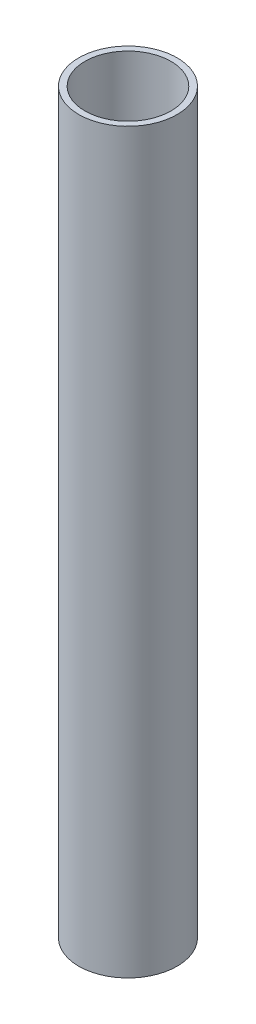
ISO-10303-21;
HEADER;
FILE_DESCRIPTION(('STEP AP214'),'2;1');
FILE_NAME('part.step','',(''),(''),'','','');
FILE_SCHEMA(('AUTOMOTIVE_DESIGN { 1 0 10303 214 1 1 1 1 }'));
ENDSEC;
DATA;
#1=APPLICATION_CONTEXT('core data for automotive mechanical design processes');
#2=APPLICATION_PROTOCOL_DEFINITION('international standard','automotive_design',2000,#1);
#3=PRODUCT_CONTEXT('',#1,'mechanical');
#4=PRODUCT('Part','Part','',(#3));
#5=PRODUCT_RELATED_PRODUCT_CATEGORY('part','',(#4));
#6=PRODUCT_DEFINITION_FORMATION('','',#4);
#7=PRODUCT_DEFINITION_CONTEXT('part definition',#1,'design');
#8=PRODUCT_DEFINITION('design','',#6,#7);
#9=PRODUCT_DEFINITION_SHAPE('','',#8);
#10=(LENGTH_UNIT() NAMED_UNIT(*) SI_UNIT(.MILLI.,.METRE.));
#11=(NAMED_UNIT(*) PLANE_ANGLE_UNIT() SI_UNIT($,.RADIAN.));
#12=(NAMED_UNIT(*) SI_UNIT($,.STERADIAN.) SOLID_ANGLE_UNIT());
#13=UNCERTAINTY_MEASURE_WITH_UNIT(LENGTH_MEASURE(1.E-05),#10,'distance_accuracy_value','');
#14=(GEOMETRIC_REPRESENTATION_CONTEXT(3) GLOBAL_UNCERTAINTY_ASSIGNED_CONTEXT((#13)) GLOBAL_UNIT_ASSIGNED_CONTEXT((#10,
#11,#12)) REPRESENTATION_CONTEXT('',''));
#15=CARTESIAN_POINT('',(0.,0.,0.));
#16=DIRECTION('',(0.,0.,1.));
#17=DIRECTION('',(1.,0.,0.));
#18=AXIS2_PLACEMENT_3D('',#15,#16,#17);
#19=CARTESIAN_POINT('',(0.,762.,0.));
#20=DIRECTION('',(0.,1.,0.));
#21=DIRECTION('',(0.,0.,1.));
#22=AXIS2_PLACEMENT_3D('',#19,#20,#21);
#23=PLANE('',#22);
#24=CARTESIAN_POINT('',(0.,762.,0.));
#25=DIRECTION('',(0.,1.,0.));
#26=DIRECTION('',(0.,0.,1.));
#27=AXIS2_PLACEMENT_3D('',#24,#25,#26);
#28=CIRCLE('',#27,50.8);
#29=CARTESIAN_POINT('',(0.,762.,50.8));
#30=VERTEX_POINT('',#29);
#31=EDGE_CURVE('E10',#30,#30,#28,.T.);
#32=ORIENTED_EDGE('',*,*,#31,.T.);
#33=EDGE_LOOP('',(#32));
#34=FACE_BOUND('',#33,.T.);
#35=CARTESIAN_POINT('',(0.,762.,0.));
#36=DIRECTION('',(0.,1.,0.));
#37=DIRECTION('',(0.,0.,1.));
#38=AXIS2_PLACEMENT_3D('',#35,#36,#37);
#39=CIRCLE('',#38,44.45);
#40=CARTESIAN_POINT('',(0.,762.,44.45));
#41=VERTEX_POINT('',#40);
#42=EDGE_CURVE('E42',#41,#41,#39,.T.);
#43=ORIENTED_EDGE('',*,*,#42,.F.);
#44=EDGE_LOOP('',(#43));
#45=FACE_BOUND('',#44,.T.);
#46=ADVANCED_FACE('F31',(#34,#45),#23,.T.);
#47=CARTESIAN_POINT('',(0.,0.,0.));
#48=DIRECTION('',(0.,1.,0.));
#49=DIRECTION('',(0.,0.,1.));
#50=AXIS2_PLACEMENT_3D('',#47,#48,#49);
#51=PLANE('',#50);
#52=CARTESIAN_POINT('',(0.,0.,0.));
#53=DIRECTION('',(0.,1.,0.));
#54=DIRECTION('',(0.,0.,1.));
#55=AXIS2_PLACEMENT_3D('',#52,#53,#54);
#56=CIRCLE('',#55,50.8);
#57=CARTESIAN_POINT('',(0.,0.,50.8));
#58=VERTEX_POINT('',#57);
#59=EDGE_CURVE('E35',#58,#58,#56,.T.);
#60=ORIENTED_EDGE('',*,*,#59,.F.);
#61=EDGE_LOOP('',(#60));
#62=FACE_BOUND('',#61,.T.);
#63=CARTESIAN_POINT('',(0.,0.,0.));
#64=DIRECTION('',(0.,1.,0.));
#65=DIRECTION('',(0.,0.,1.));
#66=AXIS2_PLACEMENT_3D('',#63,#64,#65);
#67=CIRCLE('',#66,44.45);
#68=CARTESIAN_POINT('',(0.,0.,44.45));
#69=VERTEX_POINT('',#68);
#70=EDGE_CURVE('E44',#69,#69,#67,.T.);
#71=ORIENTED_EDGE('',*,*,#70,.T.);
#72=EDGE_LOOP('',(#71));
#73=FACE_BOUND('',#72,.T.);
#74=ADVANCED_FACE('F54',(#62,#73),#51,.F.);
#75=CARTESIAN_POINT('',(0.,762.,0.));
#76=DIRECTION('',(0.,-1.,0.));
#77=DIRECTION('',(0.,0.,-1.));
#78=AXIS2_PLACEMENT_3D('',#75,#76,#77);
#79=CYLINDRICAL_SURFACE('',#78,50.8);
#80=ORIENTED_EDGE('',*,*,#31,.F.);
#81=EDGE_LOOP('',(#80));
#82=FACE_BOUND('',#81,.T.);
#83=ORIENTED_EDGE('',*,*,#59,.T.);
#84=EDGE_LOOP('',(#83));
#85=FACE_BOUND('',#84,.T.);
#86=ADVANCED_FACE('F33',(#82,#85),#79,.T.);
#87=CARTESIAN_POINT('',(0.,762.,0.));
#88=DIRECTION('',(0.,-1.,0.));
#89=DIRECTION('',(0.,0.,-1.));
#90=AXIS2_PLACEMENT_3D('',#87,#88,#89);
#91=CYLINDRICAL_SURFACE('',#90,44.45);
#92=ORIENTED_EDGE('',*,*,#42,.T.);
#93=EDGE_LOOP('',(#92));
#94=FACE_BOUND('',#93,.T.);
#95=ORIENTED_EDGE('',*,*,#70,.F.);
#96=EDGE_LOOP('',(#95));
#97=FACE_BOUND('',#96,.T.);
#98=ADVANCED_FACE('F50',(#94,#97),#91,.F.);
#99=CLOSED_SHELL('',(#46,#74,#86,#98));
#100=MANIFOLD_SOLID_BREP('B2',#99);
#101=ADVANCED_BREP_SHAPE_REPRESENTATION('',(#18,#100),#14);
#102=SHAPE_DEFINITION_REPRESENTATION(#9,#101);
ENDSEC;
END-ISO-10303-21;
